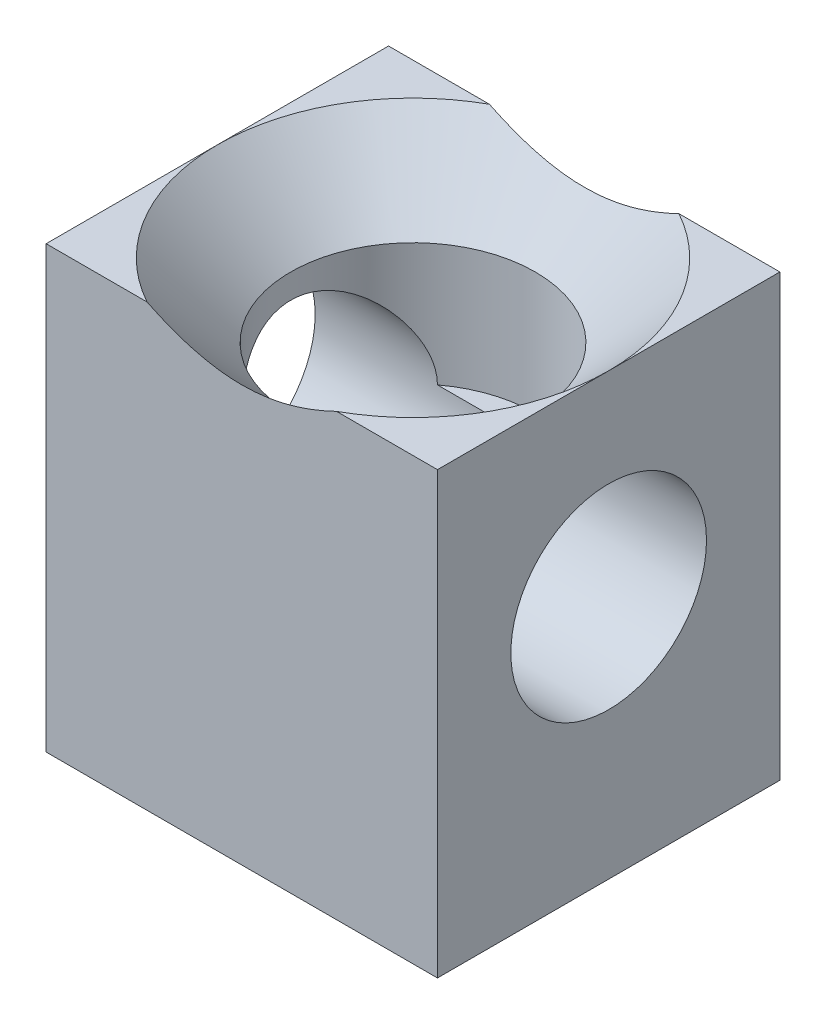
ISO-10303-21;
HEADER;
FILE_DESCRIPTION(('STEP AP214'),'2;1');
FILE_NAME('part.step','',(''),(''),'','','');
FILE_SCHEMA(('AUTOMOTIVE_DESIGN { 1 0 10303 214 1 1 1 1 }'));
ENDSEC;
DATA;
#1=APPLICATION_CONTEXT('core data for automotive mechanical design processes');
#2=APPLICATION_PROTOCOL_DEFINITION('international standard','automotive_design',2000,#1);
#3=PRODUCT_CONTEXT('',#1,'mechanical');
#4=PRODUCT('Part','Part','',(#3));
#5=PRODUCT_RELATED_PRODUCT_CATEGORY('part','',(#4));
#6=PRODUCT_DEFINITION_FORMATION('','',#4);
#7=PRODUCT_DEFINITION_CONTEXT('part definition',#1,'design');
#8=PRODUCT_DEFINITION('design','',#6,#7);
#9=PRODUCT_DEFINITION_SHAPE('','',#8);
#10=(LENGTH_UNIT() NAMED_UNIT(*) SI_UNIT(.MILLI.,.METRE.));
#11=(NAMED_UNIT(*) PLANE_ANGLE_UNIT() SI_UNIT($,.RADIAN.));
#12=(NAMED_UNIT(*) SI_UNIT($,.STERADIAN.) SOLID_ANGLE_UNIT());
#13=UNCERTAINTY_MEASURE_WITH_UNIT(LENGTH_MEASURE(1.E-05),#10,'distance_accuracy_value','');
#14=(GEOMETRIC_REPRESENTATION_CONTEXT(3) GLOBAL_UNCERTAINTY_ASSIGNED_CONTEXT((#13)) GLOBAL_UNIT_ASSIGNED_CONTEXT((#10,
#11,#12)) REPRESENTATION_CONTEXT('',''));
#15=CARTESIAN_POINT('',(0.,0.,0.));
#16=DIRECTION('',(0.,0.,1.));
#17=DIRECTION('',(1.,0.,0.));
#18=AXIS2_PLACEMENT_3D('',#15,#16,#17);
#19=CARTESIAN_POINT('',(0.,4.5,0.));
#20=DIRECTION('',(0.,1.,0.));
#21=DIRECTION('',(0.,0.,1.));
#22=AXIS2_PLACEMENT_3D('',#19,#20,#21);
#23=PLANE('',#22);
#24=CARTESIAN_POINT('',(0.,4.5,0.));
#25=DIRECTION('',(0.,1.,0.));
#26=DIRECTION('',(0.,0.,1.));
#27=AXIS2_PLACEMENT_3D('',#24,#25,#26);
#28=CIRCLE('',#27,2.);
#29=CARTESIAN_POINT('',(0.968245836551855,4.5,1.75));
#30=VERTEX_POINT('',#29);
#31=CARTESIAN_POINT('',(2.,4.5,0.));
#32=VERTEX_POINT('',#31);
#33=EDGE_CURVE('E254',#30,#32,#28,.T.);
#34=ORIENTED_EDGE('',*,*,#33,.F.);
#35=DIRECTION('',(1.,0.,0.));
#36=VECTOR('',#35,1.);
#37=CARTESIAN_POINT('',(-2.,4.5,1.75));
#38=LINE('',#37,#36);
#39=CARTESIAN_POINT('',(2.,4.5,1.75));
#40=VERTEX_POINT('',#39);
#41=EDGE_CURVE('E176',#30,#40,#38,.T.);
#42=ORIENTED_EDGE('',*,*,#41,.T.);
#43=DIRECTION('',(0.,0.,-1.));
#44=VECTOR('',#43,1.);
#45=CARTESIAN_POINT('',(2.,4.5,-1.75));
#46=LINE('',#45,#44);
#47=EDGE_CURVE('E185',#40,#32,#46,.T.);
#48=ORIENTED_EDGE('',*,*,#47,.T.);
#49=EDGE_LOOP('',(#34,#42,#48));
#50=FACE_BOUND('',#49,.T.);
#51=ADVANCED_FACE('F35',(#50),#23,.T.);
#52=CARTESIAN_POINT('',(0.968245836551853,4.5,-1.75));
#53=VERTEX_POINT('',#52);
#54=EDGE_CURVE('E245',#32,#53,#28,.T.);
#55=ORIENTED_EDGE('',*,*,#54,.F.);
#56=CARTESIAN_POINT('',(2.,4.5,-1.75));
#57=VERTEX_POINT('',#56);
#58=EDGE_CURVE('E165',#32,#57,#46,.T.);
#59=ORIENTED_EDGE('',*,*,#58,.T.);
#60=DIRECTION('',(-1.,0.,0.));
#61=VECTOR('',#60,1.);
#62=CARTESIAN_POINT('',(-2.,4.5,-1.75));
#63=LINE('',#62,#61);
#64=EDGE_CURVE('E181',#57,#53,#63,.T.);
#65=ORIENTED_EDGE('',*,*,#64,.T.);
#66=EDGE_LOOP('',(#55,#59,#65));
#67=FACE_BOUND('',#66,.T.);
#68=ADVANCED_FACE('F215',(#67),#23,.T.);
#69=CARTESIAN_POINT('',(-0.968245836551853,4.5,-1.75));
#70=VERTEX_POINT('',#69);
#71=CARTESIAN_POINT('',(-2.,4.5,0.));
#72=VERTEX_POINT('',#71);
#73=EDGE_CURVE('E241',#70,#72,#28,.T.);
#74=ORIENTED_EDGE('',*,*,#73,.F.);
#75=CARTESIAN_POINT('',(-2.,4.5,-1.75));
#76=VERTEX_POINT('',#75);
#77=EDGE_CURVE('E184',#70,#76,#63,.T.);
#78=ORIENTED_EDGE('',*,*,#77,.T.);
#79=DIRECTION('',(0.,0.,1.));
#80=VECTOR('',#79,1.);
#81=CARTESIAN_POINT('',(-2.,4.5,-1.75));
#82=LINE('',#81,#80);
#83=EDGE_CURVE('E177',#76,#72,#82,.T.);
#84=ORIENTED_EDGE('',*,*,#83,.T.);
#85=EDGE_LOOP('',(#74,#78,#84));
#86=FACE_BOUND('',#85,.T.);
#87=ADVANCED_FACE('F220',(#86),#23,.T.);
#88=CARTESIAN_POINT('',(2.,4.5,-1.75));
#89=DIRECTION('',(-1.,0.,0.));
#90=DIRECTION('',(0.,0.,1.));
#91=AXIS2_PLACEMENT_3D('',#88,#89,#90);
#92=PLANE('',#91);
#93=CARTESIAN_POINT('',(2.,2.5,0.));
#94=DIRECTION('',(1.,0.,0.));
#95=DIRECTION('',(0.,0.,-1.));
#96=AXIS2_PLACEMENT_3D('',#93,#94,#95);
#97=CIRCLE('',#96,1.);
#98=CARTESIAN_POINT('',(2.,2.5,-1.));
#99=VERTEX_POINT('',#98);
#100=EDGE_CURVE('E190',#99,#99,#97,.T.);
#101=ORIENTED_EDGE('',*,*,#100,.F.);
#102=EDGE_LOOP('',(#101));
#103=FACE_BOUND('',#102,.T.);
#104=DIRECTION('',(0.,0.,-1.));
#105=VECTOR('',#104,1.);
#106=CARTESIAN_POINT('',(2.,0.,-1.75));
#107=LINE('',#106,#105);
#108=CARTESIAN_POINT('',(2.,0.,1.75));
#109=VERTEX_POINT('',#108);
#110=CARTESIAN_POINT('',(2.,0.,-1.75));
#111=VERTEX_POINT('',#110);
#112=EDGE_CURVE('E170',#109,#111,#107,.T.);
#113=ORIENTED_EDGE('',*,*,#112,.T.);
#114=DIRECTION('',(0.,-1.,0.));
#115=VECTOR('',#114,1.);
#116=CARTESIAN_POINT('',(2.,4.5,-1.75));
#117=LINE('',#116,#115);
#118=EDGE_CURVE('E150',#57,#111,#117,.T.);
#119=ORIENTED_EDGE('',*,*,#118,.F.);
#120=ORIENTED_EDGE('',*,*,#58,.F.);
#121=ORIENTED_EDGE('',*,*,#47,.F.);
#122=DIRECTION('',(0.,-1.,0.));
#123=VECTOR('',#122,1.);
#124=CARTESIAN_POINT('',(2.,4.5,1.75));
#125=LINE('',#124,#123);
#126=EDGE_CURVE('E159',#40,#109,#125,.T.);
#127=ORIENTED_EDGE('',*,*,#126,.T.);
#128=EDGE_LOOP('',(#113,#119,#120,#121,#127));
#129=FACE_BOUND('',#128,.T.);
#130=ADVANCED_FACE('F234',(#103,#129),#92,.F.);
#131=CARTESIAN_POINT('',(-2.,4.5,-1.75));
#132=DIRECTION('',(0.,0.,1.));
#133=DIRECTION('',(1.,0.,0.));
#134=AXIS2_PLACEMENT_3D('',#131,#132,#133);
#135=PLANE('',#134);
#136=ORIENTED_EDGE('',*,*,#77,.F.);
#137=CARTESIAN_POINT('',(-6.62768805504223,9.35483398449221,-1.75));
#138=CARTESIAN_POINT('',(-6.45482961975811,9.18771886415632,-1.75));
#139=CARTESIAN_POINT('',(-6.28177237700151,9.02080837157476,-1.75));
#140=CARTESIAN_POINT('',(-5.9351047060048,8.68753871408963,-1.75));
#141=CARTESIAN_POINT('',(-5.76149423992591,8.52117958855751,-1.75));
#142=CARTESIAN_POINT('',(-5.41303660463575,8.18865130797469,-1.75));
#143=CARTESIAN_POINT('',(-5.23818725916148,8.02248443153272,-1.75));
#144=CARTESIAN_POINT('',(-4.88758909123882,7.69112124991913,-1.75));
#145=CARTESIAN_POINT('',(-4.71184032063121,7.52592488996223,-1.75));
#146=CARTESIAN_POINT('',(-4.33702848710739,7.17623778082812,-1.75));
#147=CARTESIAN_POINT('',(-4.13780221478432,6.99192176259483,-1.75));
#148=CARTESIAN_POINT('',(-3.73706155990107,6.62570432803264,-1.75));
#149=CARTESIAN_POINT('',(-3.53554675410239,6.44380337229266,-1.75));
#150=CARTESIAN_POINT('',(-3.23084818793502,6.17405637662397,-1.75));
#151=CARTESIAN_POINT('',(-3.12897009173888,6.0847368639694,-1.75));
#152=CARTESIAN_POINT('',(-2.92410452042185,5.90738100264461,-1.75));
#153=CARTESIAN_POINT('',(-2.82111707271589,5.81934462239082,-1.75));
#154=CARTESIAN_POINT('',(-2.61374372888776,5.64499694751301,-1.75));
#155=CARTESIAN_POINT('',(-2.50935827685023,5.55868512580907,-1.75));
#156=CARTESIAN_POINT('',(-2.29871712859565,5.38838046193927,-1.75));
#157=CARTESIAN_POINT('',(-2.19246162751162,5.30438738014292,-1.75));
#158=CARTESIAN_POINT('',(-2.02919544382756,5.17933950621071,-1.75));
#159=CARTESIAN_POINT('',(-1.97310632372345,5.13708194894178,-1.75));
#160=CARTESIAN_POINT('',(-1.86012546624115,5.05364689721281,-1.75));
#161=CARTESIAN_POINT('',(-1.80323370249509,5.01246943836304,-1.75));
#162=CARTESIAN_POINT('',(-1.68842852740753,4.93138585123504,-1.75));
#163=CARTESIAN_POINT('',(-1.63051379946449,4.89148157999521,-1.75));
#164=CARTESIAN_POINT('',(-1.51357480408458,4.81333437247752,-1.75));
#165=CARTESIAN_POINT('',(-1.45455057544476,4.77509137826233,-1.75));
#166=CARTESIAN_POINT('',(-1.33614252783812,4.70128745805456,-1.75));
#167=CARTESIAN_POINT('',(-1.27677963790033,4.66569336683518,-1.75));
#168=CARTESIAN_POINT('',(-1.15658627587798,4.59708385834969,-1.75));
#169=CARTESIAN_POINT('',(-1.09575547989993,4.56406901713229,-1.75));
#170=CARTESIAN_POINT('',(-0.910985367926191,4.47005709221326,-1.75));
#171=CARTESIAN_POINT('',(-0.784405276314615,4.41385644482116,-1.75));
#172=CARTESIAN_POINT('',(-0.599872233192017,4.34926618820074,-1.75));
#173=CARTESIAN_POINT('',(-0.544974583306539,4.33211410010346,-1.75));
#174=CARTESIAN_POINT('',(-0.433972742965373,4.30221360482209,-1.75));
#175=CARTESIAN_POINT('',(-0.377868613998475,4.28946497377605,-1.75));
#176=CARTESIAN_POINT('',(-0.265065147830526,4.26909704840938,-1.75));
#177=CARTESIAN_POINT('',(-0.208371277894996,4.26144792467565,-1.75));
#178=CARTESIAN_POINT('',(-0.0945064941806795,4.25163262439728,-1.75));
#179=CARTESIAN_POINT('',(-0.0373356280735548,4.24946590636576,-1.75));
#180=CARTESIAN_POINT('',(0.0753658312201111,4.25074035775581,-1.75));
#181=CARTESIAN_POINT('',(0.130898242639494,4.25402875278159,-1.75));
#182=CARTESIAN_POINT('',(0.241416342152597,4.26571813439241,-1.75));
#183=CARTESIAN_POINT('',(0.296401996301986,4.27411943641272,-1.75));
#184=CARTESIAN_POINT('',(0.405764352088828,4.29561969189216,-1.75));
#185=CARTESIAN_POINT('',(0.460135680729447,4.30874557720217,-1.75));
#186=CARTESIAN_POINT('',(0.56771957642667,4.33906012336585,-1.75));
#187=CARTESIAN_POINT('',(0.620932045368061,4.35624912677544,-1.75));
#188=CARTESIAN_POINT('',(0.791339642393329,4.41744568848813,-1.75));
#189=CARTESIAN_POINT('',(0.906078140444656,4.4682841088048,-1.75));
#190=CARTESIAN_POINT('',(1.13007050807704,4.58090114318651,-1.75));
#191=CARTESIAN_POINT('',(1.23931254799352,4.64270215832057,-1.75));
#192=CARTESIAN_POINT('',(1.45489855185435,4.77417147925257,-1.75));
#193=CARTESIAN_POINT('',(1.5611848495673,4.84393327121475,-1.75));
#194=CARTESIAN_POINT('',(1.71806024327131,4.9521042978235,-1.75));
#195=CARTESIAN_POINT('',(1.76990280456178,4.98873147696399,-1.75));
#196=CARTESIAN_POINT('',(1.8728696301568,5.06298021408703,-1.75));
#197=CARTESIAN_POINT('',(1.92399392207393,5.10060173368288,-1.75));
#198=CARTESIAN_POINT('',(2.09392564362365,5.22777428597573,-1.75));
#199=CARTESIAN_POINT('',(2.21135549115547,5.31916425130189,-1.75));
#200=CARTESIAN_POINT('',(2.44380514782676,5.50496835155791,-1.75));
#201=CARTESIAN_POINT('',(2.55882456727267,5.59938296933827,-1.75));
#202=CARTESIAN_POINT('',(2.78712732522528,5.79039023764007,-1.75));
#203=CARTESIAN_POINT('',(2.9004098268011,5.88698388595508,-1.75));
#204=CARTESIAN_POINT('',(3.12562293842309,6.08173700728651,-1.75));
#205=CARTESIAN_POINT('',(3.23755350316451,6.17989653252262,-1.75));
#206=CARTESIAN_POINT('',(3.57229047449426,6.47655094131224,-1.75));
#207=CARTESIAN_POINT('',(3.79354270059744,6.67679729732336,-1.75));
#208=CARTESIAN_POINT('',(4.23340844416047,7.08002544866716,-1.75));
#209=CARTESIAN_POINT('',(4.45202269258349,7.28300645164695,-1.75));
#210=CARTESIAN_POINT('',(4.86189249954168,7.66681421413714,-1.75));
#211=CARTESIAN_POINT('',(5.05333966154553,7.8474365864303,-1.75));
#212=CARTESIAN_POINT('',(5.43526976488431,8.20972976390521,-1.75));
#213=CARTESIAN_POINT('',(5.62575262086669,8.3914006589501,-1.75));
#214=CARTESIAN_POINT('',(6.00523335239158,8.75478535744965,-1.75));
#215=CARTESIAN_POINT('',(6.19423412137585,8.93649614179492,-1.75));
#216=CARTESIAN_POINT('',(6.57164869711381,9.30048856455463,-1.75));
#217=CARTESIAN_POINT('',(6.76006256090261,9.48277014381338,-1.75));
#218=CARTESIAN_POINT('',(6.94827159212863,9.6652619015624,-1.75));
#219=B_SPLINE_CURVE_WITH_KNOTS('',3,(#137,#138,#139,#140,#141,#142,#143,#144,#145,#146,#147,
#148,#149,#150,#151,#152,#153,#154,#155,#156,#157,#158,#159,#160,#161,#162,#163,#164,#165,#166,
#167,#168,#169,#170,#171,#172,#173,#174,#175,#176,#177,#178,#179,#180,#181,#182,#183,#184,#185,
#186,#187,#188,#189,#190,#191,#192,#193,#194,#195,#196,#197,#198,#199,#200,#201,#202,#203,#204,
#205,#206,#207,#208,#209,#210,#211,#212,#213,#214,#215,#216,#217,#218),.UNSPECIFIED.,.F.,.F.,(4,
2,2,2,2,2,2,2,2,2,2,2,2,2,2,2,2,2,2,2,2,2,2,2,2,2,2,2,2,2,2,2,2,2,2,2,2,2,2,2,4),(0.,
0.721296615378912,1.44264367212488,2.16628010766671,2.88987529397036,3.70409504298641,
4.51846790770482,4.92492567648222,5.33137342358057,5.73769498606433,6.14397439879176,
6.35464230627154,6.56531715065101,6.77628640310788,6.98724829205808,7.19482866080171,
7.40245525871022,7.81641268847667,7.9888142907186,8.16120712715654,8.33258249593114,
8.50394093762218,8.6705809007091,8.83723114551078,9.00484680583583,9.17247660265114,
9.54790725382545,9.92411409143061,10.3053113776223,10.4957326570247,10.6861465958834,
11.1324661383442,11.5788572890856,12.0254571700177,12.4720719756629,13.367267300864,
14.2622085988916,15.0518157609981,15.8414916318264,16.628040225382,17.4145098361796),.UNSPECIFIED.);
#220=EDGE_CURVE('E123',#70,#53,#219,.T.);
#221=ORIENTED_EDGE('',*,*,#220,.T.);
#222=ORIENTED_EDGE('',*,*,#64,.F.);
#223=ORIENTED_EDGE('',*,*,#118,.T.);
#224=DIRECTION('',(-1.,0.,0.));
#225=VECTOR('',#224,1.);
#226=CARTESIAN_POINT('',(-2.,0.,-1.75));
#227=LINE('',#226,#225);
#228=CARTESIAN_POINT('',(-2.,0.,-1.75));
#229=VERTEX_POINT('',#228);
#230=EDGE_CURVE('E168',#111,#229,#227,.T.);
#231=ORIENTED_EDGE('',*,*,#230,.T.);
#232=DIRECTION('',(0.,-1.,0.));
#233=VECTOR('',#232,1.);
#234=CARTESIAN_POINT('',(-2.,4.5,-1.75));
#235=LINE('',#234,#233);
#236=EDGE_CURVE('E153',#76,#229,#235,.T.);
#237=ORIENTED_EDGE('',*,*,#236,.F.);
#238=EDGE_LOOP('',(#136,#221,#222,#223,#231,#237));
#239=FACE_BOUND('',#238,.T.);
#240=ADVANCED_FACE('F200',(#239),#135,.F.);
#241=CARTESIAN_POINT('',(-2.,4.5,-1.75));
#242=DIRECTION('',(1.,0.,0.));
#243=DIRECTION('',(0.,0.,-1.));
#244=AXIS2_PLACEMENT_3D('',#241,#242,#243);
#245=PLANE('',#244);
#246=CARTESIAN_POINT('',(-2.,2.5,0.));
#247=DIRECTION('',(1.,0.,0.));
#248=DIRECTION('',(0.,0.,-1.));
#249=AXIS2_PLACEMENT_3D('',#246,#247,#248);
#250=CIRCLE('',#249,1.);
#251=CARTESIAN_POINT('',(-2.,2.5,-1.));
#252=VERTEX_POINT('',#251);
#253=EDGE_CURVE('E173',#252,#252,#250,.T.);
#254=ORIENTED_EDGE('',*,*,#253,.T.);
#255=EDGE_LOOP('',(#254));
#256=FACE_BOUND('',#255,.T.);
#257=DIRECTION('',(0.,0.,1.));
#258=VECTOR('',#257,1.);
#259=CARTESIAN_POINT('',(-2.,0.,-1.75));
#260=LINE('',#259,#258);
#261=CARTESIAN_POINT('',(-2.,0.,1.75));
#262=VERTEX_POINT('',#261);
#263=EDGE_CURVE('E166',#229,#262,#260,.T.);
#264=ORIENTED_EDGE('',*,*,#263,.T.);
#265=DIRECTION('',(0.,-1.,0.));
#266=VECTOR('',#265,1.);
#267=CARTESIAN_POINT('',(-2.,4.5,1.75));
#268=LINE('',#267,#266);
#269=CARTESIAN_POINT('',(-2.,4.5,1.75));
#270=VERTEX_POINT('',#269);
#271=EDGE_CURVE('E156',#270,#262,#268,.T.);
#272=ORIENTED_EDGE('',*,*,#271,.F.);
#273=EDGE_CURVE('E180',#72,#270,#82,.T.);
#274=ORIENTED_EDGE('',*,*,#273,.F.);
#275=ORIENTED_EDGE('',*,*,#83,.F.);
#276=ORIENTED_EDGE('',*,*,#236,.T.);
#277=EDGE_LOOP('',(#264,#272,#274,#275,#276));
#278=FACE_BOUND('',#277,.T.);
#279=ADVANCED_FACE('F231',(#256,#278),#245,.F.);
#280=CARTESIAN_POINT('',(-2.,4.5,1.75));
#281=DIRECTION('',(0.,0.,-1.));
#282=DIRECTION('',(-1.,0.,0.));
#283=AXIS2_PLACEMENT_3D('',#280,#281,#282);
#284=PLANE('',#283);
#285=ORIENTED_EDGE('',*,*,#41,.F.);
#286=CARTESIAN_POINT('',(-6.62768805504223,9.35483398449222,1.75));
#287=CARTESIAN_POINT('',(-6.45482961975812,9.18771886415633,1.75));
#288=CARTESIAN_POINT('',(-6.28177237700152,9.02080837157477,1.75));
#289=CARTESIAN_POINT('',(-5.93510470600481,8.68753871408964,1.75));
#290=CARTESIAN_POINT('',(-5.76149423992592,8.52117958855751,1.75));
#291=CARTESIAN_POINT('',(-5.41303660463576,8.18865130797469,1.75));
#292=CARTESIAN_POINT('',(-5.23818725916149,8.02248443153273,1.75));
#293=CARTESIAN_POINT('',(-4.88758909123883,7.69112124991914,1.75));
#294=CARTESIAN_POINT('',(-4.71184032063122,7.52592488996224,1.75));
#295=CARTESIAN_POINT('',(-4.3370284871074,7.17623778082813,1.75));
#296=CARTESIAN_POINT('',(-4.13780221478433,6.99192176259484,1.75));
#297=CARTESIAN_POINT('',(-3.73706155990108,6.62570432803264,1.75));
#298=CARTESIAN_POINT('',(-3.5355467541024,6.44380337229267,1.75));
#299=CARTESIAN_POINT('',(-3.23084818793502,6.17405637662398,1.75));
#300=CARTESIAN_POINT('',(-3.12897009173889,6.08473686396941,1.75));
#301=CARTESIAN_POINT('',(-2.92410452042186,5.90738100264461,1.75));
#302=CARTESIAN_POINT('',(-2.8211170727159,5.81934462239082,1.75));
#303=CARTESIAN_POINT('',(-2.61374372888777,5.64499694751301,1.75));
#304=CARTESIAN_POINT('',(-2.50935827685023,5.55868512580907,1.75));
#305=CARTESIAN_POINT('',(-2.29871712859565,5.38838046193927,1.75));
#306=CARTESIAN_POINT('',(-2.19246162751163,5.30438738014292,1.75));
#307=CARTESIAN_POINT('',(-2.02919544382757,5.17933950621071,1.75));
#308=CARTESIAN_POINT('',(-1.97310632372345,5.13708194894178,1.75));
#309=CARTESIAN_POINT('',(-1.86012546624115,5.05364689721281,1.75));
#310=CARTESIAN_POINT('',(-1.8032337024951,5.01246943836304,1.75));
#311=CARTESIAN_POINT('',(-1.68842852740753,4.93138585123504,1.75));
#312=CARTESIAN_POINT('',(-1.63051379946449,4.89148157999521,1.75));
#313=CARTESIAN_POINT('',(-1.51357480408458,4.81333437247752,1.75));
#314=CARTESIAN_POINT('',(-1.45455057544476,4.77509137826233,1.75));
#315=CARTESIAN_POINT('',(-1.33614252783812,4.70128745805455,1.75));
#316=CARTESIAN_POINT('',(-1.27677963790033,4.66569336683517,1.75));
#317=CARTESIAN_POINT('',(-1.15658627587798,4.59708385834969,1.75));
#318=CARTESIAN_POINT('',(-1.09575547989993,4.56406901713229,1.75));
#319=CARTESIAN_POINT('',(-0.910985367926192,4.47005709221325,1.75));
#320=CARTESIAN_POINT('',(-0.784405276314617,4.41385644482116,1.75));
#321=CARTESIAN_POINT('',(-0.599872233192018,4.34926618820074,1.75));
#322=CARTESIAN_POINT('',(-0.54497458330654,4.33211410010346,1.75));
#323=CARTESIAN_POINT('',(-0.433972742965374,4.30221360482209,1.75));
#324=CARTESIAN_POINT('',(-0.377868613998476,4.28946497377605,1.75));
#325=CARTESIAN_POINT('',(-0.265065147830528,4.26909704840938,1.75));
#326=CARTESIAN_POINT('',(-0.208371277894998,4.26144792467565,1.75));
#327=CARTESIAN_POINT('',(-0.0945064941806812,4.25163262439728,1.75));
#328=CARTESIAN_POINT('',(-0.037335628073556,4.24946590636576,1.75));
#329=CARTESIAN_POINT('',(0.0753658312201101,4.25074035775581,1.75));
#330=CARTESIAN_POINT('',(0.130898242639493,4.25402875278159,1.75));
#331=CARTESIAN_POINT('',(0.241416342152596,4.26571813439241,1.75));
#332=CARTESIAN_POINT('',(0.296401996301985,4.27411943641272,1.75));
#333=CARTESIAN_POINT('',(0.405764352088827,4.29561969189216,1.75));
#334=CARTESIAN_POINT('',(0.460135680729445,4.30874557720217,1.75));
#335=CARTESIAN_POINT('',(0.567719576426668,4.33906012336585,1.75));
#336=CARTESIAN_POINT('',(0.620932045368059,4.35624912677544,1.75));
#337=CARTESIAN_POINT('',(0.791339642393328,4.41744568848813,1.75));
#338=CARTESIAN_POINT('',(0.906078140444655,4.4682841088048,1.75));
#339=CARTESIAN_POINT('',(1.13007050807704,4.58090114318651,1.75));
#340=CARTESIAN_POINT('',(1.23931254799352,4.64270215832057,1.75));
#341=CARTESIAN_POINT('',(1.45489855185435,4.77417147925257,1.75));
#342=CARTESIAN_POINT('',(1.5611848495673,4.84393327121475,1.75));
#343=CARTESIAN_POINT('',(1.71806024327131,4.9521042978235,1.75));
#344=CARTESIAN_POINT('',(1.76990280456178,4.98873147696399,1.75));
#345=CARTESIAN_POINT('',(1.8728696301568,5.06298021408703,1.75));
#346=CARTESIAN_POINT('',(1.92399392207392,5.10060173368288,1.75));
#347=CARTESIAN_POINT('',(2.09392564362365,5.22777428597572,1.75));
#348=CARTESIAN_POINT('',(2.21135549115547,5.31916425130188,1.75));
#349=CARTESIAN_POINT('',(2.44380514782676,5.50496835155791,1.75));
#350=CARTESIAN_POINT('',(2.55882456727267,5.59938296933826,1.75));
#351=CARTESIAN_POINT('',(2.78712732522528,5.79039023764007,1.75));
#352=CARTESIAN_POINT('',(2.9004098268011,5.88698388595508,1.75));
#353=CARTESIAN_POINT('',(3.12562293842309,6.08173700728651,1.75));
#354=CARTESIAN_POINT('',(3.2375535031645,6.17989653252262,1.75));
#355=CARTESIAN_POINT('',(3.57229047449426,6.47655094131224,1.75));
#356=CARTESIAN_POINT('',(3.79354270059744,6.67679729732336,1.75));
#357=CARTESIAN_POINT('',(4.23340844416047,7.08002544866716,1.75));
#358=CARTESIAN_POINT('',(4.45202269258349,7.28300645164695,1.75));
#359=CARTESIAN_POINT('',(4.86189249954168,7.66681421413713,1.75));
#360=CARTESIAN_POINT('',(5.05333966154553,7.8474365864303,1.75));
#361=CARTESIAN_POINT('',(5.43526976488431,8.20972976390521,1.75));
#362=CARTESIAN_POINT('',(5.62575262086668,8.39140065895009,1.75));
#363=CARTESIAN_POINT('',(6.00523335239157,8.75478535744964,1.75));
#364=CARTESIAN_POINT('',(6.19423412137585,8.93649614179492,1.75));
#365=CARTESIAN_POINT('',(6.5716486971138,9.30048856455462,1.75));
#366=CARTESIAN_POINT('',(6.7600625609026,9.48277014381337,1.75));
#367=CARTESIAN_POINT('',(6.94827159212862,9.66526190156239,1.75));
#368=B_SPLINE_CURVE_WITH_KNOTS('',3,(#286,#287,#288,#289,#290,#291,#292,#293,#294,#295,#296,
#297,#298,#299,#300,#301,#302,#303,#304,#305,#306,#307,#308,#309,#310,#311,#312,#313,#314,#315,
#316,#317,#318,#319,#320,#321,#322,#323,#324,#325,#326,#327,#328,#329,#330,#331,#332,#333,#334,
#335,#336,#337,#338,#339,#340,#341,#342,#343,#344,#345,#346,#347,#348,#349,#350,#351,#352,#353,
#354,#355,#356,#357,#358,#359,#360,#361,#362,#363,#364,#365,#366,#367),.UNSPECIFIED.,.F.,.F.,(4,
2,2,2,2,2,2,2,2,2,2,2,2,2,2,2,2,2,2,2,2,2,2,2,2,2,2,2,2,2,2,2,2,2,2,2,2,2,2,2,4),(0.,
0.721296615378912,1.44264367212488,2.16628010766671,2.88987529397036,3.70409504298642,
4.51846790770482,4.92492567648222,5.33137342358057,5.73769498606434,6.14397439879177,
6.35464230627155,6.56531715065102,6.7762864031079,6.98724829205809,7.19482866080172,
7.40245525871023,7.81641268847668,7.98881429071861,8.16120712715655,8.33258249593115,
8.5039409376222,8.67058090070912,8.8372311455108,9.00484680583584,9.17247660265116,
9.54790725382547,9.92411409143062,10.3053113776224,10.4957326570247,10.6861465958834,
11.1324661383442,11.5788572890856,12.0254571700177,12.4720719756629,13.3672673008641,
14.2622085988916,15.0518157609981,15.8414916318264,16.628040225382,17.4145098361796),.UNSPECIFIED.);
#369=CARTESIAN_POINT('',(-0.968245836551855,4.5,1.75));
#370=VERTEX_POINT('',#369);
#371=EDGE_CURVE('E11',#30,#370,#368,.F.);
#372=ORIENTED_EDGE('',*,*,#371,.T.);
#373=EDGE_CURVE('E162',#270,#370,#38,.T.);
#374=ORIENTED_EDGE('',*,*,#373,.F.);
#375=ORIENTED_EDGE('',*,*,#271,.T.);
#376=DIRECTION('',(1.,0.,0.));
#377=VECTOR('',#376,1.);
#378=CARTESIAN_POINT('',(-2.,0.,1.75));
#379=LINE('',#378,#377);
#380=EDGE_CURVE('E163',#262,#109,#379,.T.);
#381=ORIENTED_EDGE('',*,*,#380,.T.);
#382=ORIENTED_EDGE('',*,*,#126,.F.);
#383=EDGE_LOOP('',(#285,#372,#374,#375,#381,#382));
#384=FACE_BOUND('',#383,.T.);
#385=ADVANCED_FACE('F224',(#384),#284,.F.);
#386=EDGE_CURVE('E56',#72,#370,#28,.T.);
#387=ORIENTED_EDGE('',*,*,#386,.F.);
#388=ORIENTED_EDGE('',*,*,#273,.T.);
#389=ORIENTED_EDGE('',*,*,#373,.T.);
#390=EDGE_LOOP('',(#387,#388,#389));
#391=FACE_BOUND('',#390,.T.);
#392=ADVANCED_FACE('F141',(#391),#23,.T.);
#393=CARTESIAN_POINT('',(0.,0.,0.));
#394=DIRECTION('',(0.,1.,0.));
#395=DIRECTION('',(0.,0.,1.));
#396=AXIS2_PLACEMENT_3D('',#393,#394,#395);
#397=PLANE('',#396);
#398=ORIENTED_EDGE('',*,*,#112,.F.);
#399=ORIENTED_EDGE('',*,*,#380,.F.);
#400=ORIENTED_EDGE('',*,*,#263,.F.);
#401=ORIENTED_EDGE('',*,*,#230,.F.);
#402=EDGE_LOOP('',(#398,#399,#400,#401));
#403=FACE_BOUND('',#402,.T.);
#404=ADVANCED_FACE('F139',(#403),#397,.F.);
#405=CARTESIAN_POINT('',(-2.,2.5,0.));
#406=DIRECTION('',(1.,0.,0.));
#407=DIRECTION('',(0.,0.,-1.));
#408=AXIS2_PLACEMENT_3D('',#405,#406,#407);
#409=CYLINDRICAL_SURFACE('',#408,1.);
#410=DIRECTION('',(1.,0.,0.));
#411=VECTOR('',#410,1.);
#412=CARTESIAN_POINT('',(-2.,2.5,1.));
#413=LINE('',#412,#411);
#414=CARTESIAN_POINT('',(-0.749999999999999,2.5,1.));
#415=VERTEX_POINT('',#414);
#416=CARTESIAN_POINT('',(0.749999999999999,2.49999999999999,1.));
#417=VERTEX_POINT('',#416);
#418=EDGE_CURVE('E118',#415,#417,#413,.T.);
#419=ORIENTED_EDGE('',*,*,#418,.T.);
#420=CARTESIAN_POINT('',(0.749999999999999,2.5,1.));
#421=CARTESIAN_POINT('',(0.74987067623704,2.53801297662761,1.00004239994648));
#422=CARTESIAN_POINT('',(0.752891030049956,2.57582751559388,0.997836474983586));
#423=CARTESIAN_POINT('',(0.763974595843187,2.64974504024551,0.989402301671296));
#424=CARTESIAN_POINT('',(0.771968438600677,2.68586433914889,0.983229346307377));
#425=CARTESIAN_POINT('',(0.795345015343169,2.76870737873198,0.964471732244661));
#426=CARTESIAN_POINT('',(0.812346903541743,2.81461238615518,0.950384680660607));
#427=CARTESIAN_POINT('',(0.85037942272485,2.90278490580684,0.916522193316677));
#428=CARTESIAN_POINT('',(0.871439227838412,2.94502265217102,0.896705010558023));
#429=CARTESIAN_POINT('',(0.923139211942924,3.04020115303047,0.843872960776305));
#430=CARTESIAN_POINT('',(0.954504023368437,3.09153882762078,0.808674279042954));
#431=CARTESIAN_POINT('',(1.0164732592259,3.18703519104032,0.729262171177428));
#432=CARTESIAN_POINT('',(1.04707901332387,3.23120731454979,0.68506597384545));
#433=CARTESIAN_POINT('',(1.09895111616673,3.30354954928989,0.59738381575907));
#434=CARTESIAN_POINT('',(1.12086929566955,3.33315765012942,0.555474703797676));
#435=CARTESIAN_POINT('',(1.16082242902013,3.38617859479577,0.466231173247663));
#436=CARTESIAN_POINT('',(1.17886270124157,3.40959993371189,0.418904323224978));
#437=CARTESIAN_POINT('',(1.20707838724441,3.44585670253357,0.327657998123032));
#438=CARTESIAN_POINT('',(1.2180539649432,3.45979164682022,0.284425664917518));
#439=CARTESIAN_POINT('',(1.23542973000579,3.48174955564611,0.195592838876207));
#440=CARTESIAN_POINT('',(1.24183253802269,3.48977590647998,0.149993718545756));
#441=CARTESIAN_POINT('',(1.24953985523491,3.499429061049,0.0575240307640933));
#442=CARTESIAN_POINT('',(1.25082663121042,3.50103360560954,0.0106496069422974));
#443=CARTESIAN_POINT('',(1.24813465733429,3.49766785324352,-0.0827084607393304));
#444=CARTESIAN_POINT('',(1.24415569505575,3.49269729106839,-0.129192088757808));
#445=CARTESIAN_POINT('',(1.23164197425201,3.47696618936472,-0.217840752947662));
#446=CARTESIAN_POINT('',(1.22336742128652,3.46653608943226,-0.260103069944626));
#447=CARTESIAN_POINT('',(1.20302304698824,3.44065312626329,-0.342084024447004));
#448=CARTESIAN_POINT('',(1.19095208673973,3.42519875570724,-0.381801894313005));
#449=CARTESIAN_POINT('',(1.16242932183416,3.38819732185162,-0.461768671333843));
#450=CARTESIAN_POINT('',(1.14566730645162,3.36620643025013,-0.501699422986386));
#451=CARTESIAN_POINT('',(1.10946555279251,3.3177247478008,-0.577363035500914));
#452=CARTESIAN_POINT('',(1.09002495442489,3.29123251093454,-0.613094541131813));
#453=CARTESIAN_POINT('',(1.04528145200121,3.22848838370232,-0.687109623020991));
#454=CARTESIAN_POINT('',(1.0195949170613,3.19134970694935,-0.724408177137869));
#455=CARTESIAN_POINT('',(0.96749193838368,3.11192087261431,-0.792656695821791));
#456=CARTESIAN_POINT('',(0.941073913470939,3.06961875086144,-0.823591452247027));
#457=CARTESIAN_POINT('',(0.892154182393671,2.98429641800953,-0.876199052099705));
#458=CARTESIAN_POINT('',(0.869518644115186,2.94172457303885,-0.898471959775694));
#459=CARTESIAN_POINT('',(0.827824809865522,2.85261466801007,-0.937018513226683));
#460=CARTESIAN_POINT('',(0.808743614557608,2.80610502049824,-0.95333126354885));
#461=CARTESIAN_POINT('',(0.779878657807462,2.71714294138014,-0.977028295888454));
#462=CARTESIAN_POINT('',(0.769070255857839,2.67532649570356,-0.985453607049307));
#463=CARTESIAN_POINT('',(0.757844645867822,2.61084794015544,-0.994079660457727));
#464=CARTESIAN_POINT('',(0.754931225091591,2.5888777407057,-0.99628744460861));
#465=CARTESIAN_POINT('',(0.750996973623874,2.54461300518792,-0.999252642595954));
#466=CARTESIAN_POINT('',(0.749981357370732,2.52231774464735,-1.0000060605793));
#467=CARTESIAN_POINT('',(0.750000000000043,2.49999999999999,-1.00000000000001));
#468=B_SPLINE_CURVE_WITH_KNOTS('',3,(#420,#421,#422,#423,#424,#425,#426,#427,#428,#429,#430,
#431,#432,#433,#434,#435,#436,#437,#438,#439,#440,#441,#442,#443,#444,#445,#446,#447,#448,#449,
#450,#451,#452,#453,#454,#455,#456,#457,#458,#459,#460,#461,#462,#463,#464,#465,#466,#467),
.UNSPECIFIED.,.F.,.F.,(4,2,2,2,2,2,2,2,2,2,2,2,2,2,2,2,2,2,2,2,2,2,2,4),(0.,0.113538161589319,
0.225527159749816,0.37750471337288,0.530618672369757,0.73871471568492,0.946415974333433,
1.11318075129622,1.27971533775768,1.41931198339593,1.55882856189424,1.69882831414268,
1.83883371433993,1.97120612225622,2.10361827960958,2.24879963014769,2.39402770742754,
2.56910640453789,2.74459876318906,2.90345202850739,3.06124350350388,3.19245916340866,
3.25915499815905,3.32603381952746),.UNSPECIFIED.);
#469=CARTESIAN_POINT('',(0.749999999999999,2.5,-1.));
#470=VERTEX_POINT('',#469);
#471=EDGE_CURVE('E49',#417,#470,#468,.T.);
#472=ORIENTED_EDGE('',*,*,#471,.T.);
#473=DIRECTION('',(1.,0.,0.));
#474=VECTOR('',#473,1.);
#475=CARTESIAN_POINT('',(-2.,2.5,-1.));
#476=LINE('',#475,#474);
#477=CARTESIAN_POINT('',(-0.749999999999999,2.49999999999999,-1.));
#478=VERTEX_POINT('',#477);
#479=EDGE_CURVE('E111',#470,#478,#476,.F.);
#480=ORIENTED_EDGE('',*,*,#479,.T.);
#481=CARTESIAN_POINT('',(-0.749999999999999,2.5,-1.));
#482=CARTESIAN_POINT('',(-0.74987067623704,2.53801297662761,-1.00004239994648));
#483=CARTESIAN_POINT('',(-0.752891030049956,2.57582751559388,-0.997836474983586));
#484=CARTESIAN_POINT('',(-0.763974595843187,2.64974504024551,-0.989402301671296));
#485=CARTESIAN_POINT('',(-0.771968438600677,2.68586433914889,-0.983229346307377));
#486=CARTESIAN_POINT('',(-0.795345015343169,2.76870737873198,-0.964471732244661));
#487=CARTESIAN_POINT('',(-0.812346903541743,2.81461238615518,-0.950384680660607));
#488=CARTESIAN_POINT('',(-0.85037942272485,2.90278490580684,-0.916522193316677));
#489=CARTESIAN_POINT('',(-0.871439227838412,2.94502265217102,-0.896705010558023));
#490=CARTESIAN_POINT('',(-0.923139211942924,3.04020115303047,-0.843872960776305));
#491=CARTESIAN_POINT('',(-0.954504023368437,3.09153882762078,-0.808674279042954));
#492=CARTESIAN_POINT('',(-1.0164732592259,3.18703519104032,-0.729262171177428));
#493=CARTESIAN_POINT('',(-1.04707901332387,3.23120731454979,-0.68506597384545));
#494=CARTESIAN_POINT('',(-1.09895111616673,3.30354954928989,-0.59738381575907));
#495=CARTESIAN_POINT('',(-1.12086929566955,3.33315765012942,-0.555474703797676));
#496=CARTESIAN_POINT('',(-1.16082242902013,3.38617859479577,-0.466231173247663));
#497=CARTESIAN_POINT('',(-1.17886270124157,3.40959993371189,-0.418904323224978));
#498=CARTESIAN_POINT('',(-1.20707838724441,3.44585670253357,-0.327657998123032));
#499=CARTESIAN_POINT('',(-1.2180539649432,3.45979164682022,-0.284425664917518));
#500=CARTESIAN_POINT('',(-1.23542973000579,3.48174955564611,-0.195592838876207));
#501=CARTESIAN_POINT('',(-1.24183253802269,3.48977590647998,-0.149993718545756));
#502=CARTESIAN_POINT('',(-1.24953985523491,3.499429061049,-0.0575240307640933));
#503=CARTESIAN_POINT('',(-1.25082663121042,3.50103360560954,-0.0106496069422974));
#504=CARTESIAN_POINT('',(-1.24813465733429,3.49766785324352,0.0827084607393304));
#505=CARTESIAN_POINT('',(-1.24415569505575,3.49269729106839,0.129192088757808));
#506=CARTESIAN_POINT('',(-1.23164197425201,3.47696618936472,0.217840752947662));
#507=CARTESIAN_POINT('',(-1.22336742128652,3.46653608943226,0.260103069944626));
#508=CARTESIAN_POINT('',(-1.20302304698824,3.44065312626329,0.342084024447004));
#509=CARTESIAN_POINT('',(-1.19095208673973,3.42519875570724,0.381801894313005));
#510=CARTESIAN_POINT('',(-1.16242932183416,3.38819732185162,0.461768671333843));
#511=CARTESIAN_POINT('',(-1.14566730645162,3.36620643025013,0.501699422986386));
#512=CARTESIAN_POINT('',(-1.10946555279251,3.3177247478008,0.577363035500914));
#513=CARTESIAN_POINT('',(-1.09002495442489,3.29123251093454,0.613094541131813));
#514=CARTESIAN_POINT('',(-1.04528145200121,3.22848838370232,0.687109623020991));
#515=CARTESIAN_POINT('',(-1.0195949170613,3.19134970694935,0.724408177137869));
#516=CARTESIAN_POINT('',(-0.96749193838368,3.11192087261431,0.792656695821791));
#517=CARTESIAN_POINT('',(-0.941073913470939,3.06961875086144,0.823591452247027));
#518=CARTESIAN_POINT('',(-0.892154182393671,2.98429641800953,0.876199052099705));
#519=CARTESIAN_POINT('',(-0.869518644115186,2.94172457303885,0.898471959775694));
#520=CARTESIAN_POINT('',(-0.827824809865522,2.85261466801007,0.937018513226683));
#521=CARTESIAN_POINT('',(-0.808743614557608,2.80610502049824,0.95333126354885));
#522=CARTESIAN_POINT('',(-0.779878657807462,2.71714294138014,0.977028295888454));
#523=CARTESIAN_POINT('',(-0.769070255857839,2.67532649570356,0.985453607049307));
#524=CARTESIAN_POINT('',(-0.757844645867822,2.61084794015544,0.994079660457727));
#525=CARTESIAN_POINT('',(-0.754931225091591,2.5888777407057,0.99628744460861));
#526=CARTESIAN_POINT('',(-0.750996973623874,2.54461300518792,0.999252642595954));
#527=CARTESIAN_POINT('',(-0.749981357370732,2.52231774464735,1.0000060605793));
#528=CARTESIAN_POINT('',(-0.750000000000043,2.49999999999999,1.00000000000001));
#529=B_SPLINE_CURVE_WITH_KNOTS('',3,(#481,#482,#483,#484,#485,#486,#487,#488,#489,#490,#491,
#492,#493,#494,#495,#496,#497,#498,#499,#500,#501,#502,#503,#504,#505,#506,#507,#508,#509,#510,
#511,#512,#513,#514,#515,#516,#517,#518,#519,#520,#521,#522,#523,#524,#525,#526,#527,#528),
.UNSPECIFIED.,.F.,.F.,(4,2,2,2,2,2,2,2,2,2,2,2,2,2,2,2,2,2,2,2,2,2,2,4),(0.,0.113538161589319,
0.225527159749816,0.37750471337288,0.530618672369757,0.73871471568492,0.946415974333433,
1.11318075129622,1.27971533775768,1.41931198339593,1.55882856189424,1.69882831414268,
1.83883371433993,1.97120612225622,2.10361827960958,2.24879963014769,2.39402770742754,
2.56910640453789,2.74459876318906,2.90345202850739,3.06124350350388,3.19245916340866,
3.25915499815905,3.32603381952746),.UNSPECIFIED.);
#530=EDGE_CURVE('E122',#478,#415,#529,.T.);
#531=ORIENTED_EDGE('',*,*,#530,.T.);
#532=EDGE_LOOP('',(#419,#472,#480,#531));
#533=FACE_BOUND('',#532,.T.);
#534=ORIENTED_EDGE('',*,*,#253,.F.);
#535=EDGE_LOOP('',(#534));
#536=FACE_BOUND('',#535,.T.);
#537=ORIENTED_EDGE('',*,*,#100,.T.);
#538=EDGE_LOOP('',(#537));
#539=FACE_BOUND('',#538,.T.);
#540=ADVANCED_FACE('F126',(#533,#536,#539),#409,.F.);
#541=CARTESIAN_POINT('',(0.,4.5,0.));
#542=DIRECTION('',(0.,1.,0.));
#543=DIRECTION('',(0.,0.,1.));
#544=AXIS2_PLACEMENT_3D('',#541,#542,#543);
#545=CONICAL_SURFACE('',#544,2.,0.785398163397449);
#546=CARTESIAN_POINT('',(0.,3.75,0.));
#547=DIRECTION('',(0.,1.,0.));
#548=DIRECTION('',(0.,0.,1.));
#549=AXIS2_PLACEMENT_3D('',#546,#547,#548);
#550=CIRCLE('',#549,1.25);
#551=CARTESIAN_POINT('',(0.,3.75,1.25));
#552=VERTEX_POINT('',#551);
#553=EDGE_CURVE('E255',#552,#552,#550,.T.);
#554=ORIENTED_EDGE('',*,*,#553,.F.);
#555=EDGE_LOOP('',(#554));
#556=FACE_BOUND('',#555,.T.);
#557=ORIENTED_EDGE('',*,*,#73,.T.);
#558=ORIENTED_EDGE('',*,*,#386,.T.);
#559=ORIENTED_EDGE('',*,*,#371,.F.);
#560=ORIENTED_EDGE('',*,*,#33,.T.);
#561=ORIENTED_EDGE('',*,*,#54,.T.);
#562=ORIENTED_EDGE('',*,*,#220,.F.);
#563=EDGE_LOOP('',(#557,#558,#559,#560,#561,#562));
#564=FACE_BOUND('',#563,.T.);
#565=ADVANCED_FACE('F138',(#556,#564),#545,.F.);
#566=CARTESIAN_POINT('',(0.,2.5,0.));
#567=DIRECTION('',(0.,-1.,0.));
#568=DIRECTION('',(0.,0.,-1.));
#569=AXIS2_PLACEMENT_3D('',#566,#567,#568);
#570=PLANE('',#569);
#571=CARTESIAN_POINT('',(0.,2.5,0.));
#572=DIRECTION('',(0.,1.,0.));
#573=DIRECTION('',(0.,0.,1.));
#574=AXIS2_PLACEMENT_3D('',#571,#572,#573);
#575=CIRCLE('',#574,1.25);
#576=EDGE_CURVE('E114',#470,#478,#575,.T.);
#577=ORIENTED_EDGE('',*,*,#576,.T.);
#578=ORIENTED_EDGE('',*,*,#479,.F.);
#579=EDGE_LOOP('',(#577,#578));
#580=FACE_BOUND('',#579,.T.);
#581=ADVANCED_FACE('F113',(#580),#570,.F.);
#582=EDGE_CURVE('E63',#415,#417,#575,.T.);
#583=ORIENTED_EDGE('',*,*,#582,.T.);
#584=ORIENTED_EDGE('',*,*,#418,.F.);
#585=EDGE_LOOP('',(#583,#584));
#586=FACE_BOUND('',#585,.T.);
#587=ADVANCED_FACE('F206',(#586),#570,.F.);
#588=CARTESIAN_POINT('',(0.,4.5,0.));
#589=DIRECTION('',(0.,1.,0.));
#590=DIRECTION('',(0.,0.,1.));
#591=AXIS2_PLACEMENT_3D('',#588,#589,#590);
#592=CYLINDRICAL_SURFACE('',#591,1.25);
#593=ORIENTED_EDGE('',*,*,#582,.F.);
#594=ORIENTED_EDGE('',*,*,#530,.F.);
#595=ORIENTED_EDGE('',*,*,#576,.F.);
#596=ORIENTED_EDGE('',*,*,#471,.F.);
#597=EDGE_LOOP('',(#593,#594,#595,#596));
#598=FACE_BOUND('',#597,.T.);
#599=ORIENTED_EDGE('',*,*,#553,.T.);
#600=EDGE_LOOP('',(#599));
#601=FACE_BOUND('',#600,.T.);
#602=ADVANCED_FACE('F120',(#598,#601),#592,.F.);
#603=CLOSED_SHELL('',(#51,#68,#87,#130,#240,#279,#385,#392,#404,#540,#565,#581,#587,#602));
#604=MANIFOLD_SOLID_BREP('B2',#603);
#605=ADVANCED_BREP_SHAPE_REPRESENTATION('',(#18,#604),#14);
#606=SHAPE_DEFINITION_REPRESENTATION(#9,#605);
ENDSEC;
END-ISO-10303-21;
